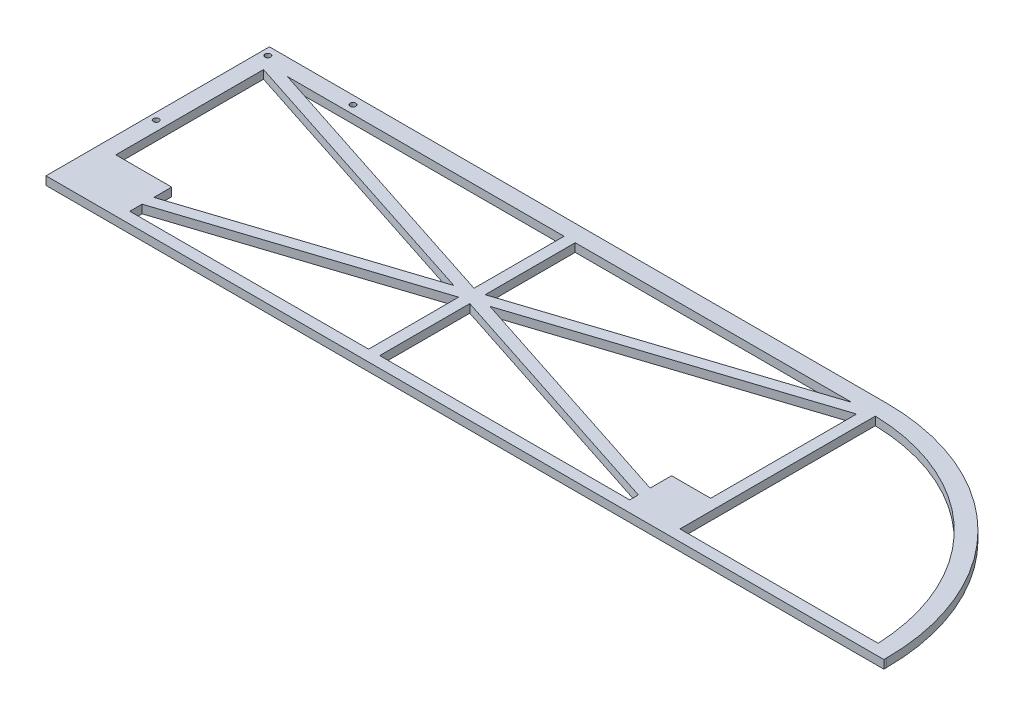
ISO-10303-21;
HEADER;
FILE_DESCRIPTION(('STEP AP214'),'2;1');
FILE_NAME('part.step','',(''),(''),'','','');
FILE_SCHEMA(('AUTOMOTIVE_DESIGN { 1 0 10303 214 1 1 1 1 }'));
ENDSEC;
DATA;
#1=APPLICATION_CONTEXT('core data for automotive mechanical design processes');
#2=APPLICATION_PROTOCOL_DEFINITION('international standard','automotive_design',2000,#1);
#3=PRODUCT_CONTEXT('',#1,'mechanical');
#4=PRODUCT('Part','Part','',(#3));
#5=PRODUCT_RELATED_PRODUCT_CATEGORY('part','',(#4));
#6=PRODUCT_DEFINITION_FORMATION('','',#4);
#7=PRODUCT_DEFINITION_CONTEXT('part definition',#1,'design');
#8=PRODUCT_DEFINITION('design','',#6,#7);
#9=PRODUCT_DEFINITION_SHAPE('','',#8);
#10=(LENGTH_UNIT() NAMED_UNIT(*) SI_UNIT(.MILLI.,.METRE.));
#11=(NAMED_UNIT(*) PLANE_ANGLE_UNIT() SI_UNIT($,.RADIAN.));
#12=(NAMED_UNIT(*) SI_UNIT($,.STERADIAN.) SOLID_ANGLE_UNIT());
#13=UNCERTAINTY_MEASURE_WITH_UNIT(LENGTH_MEASURE(1.E-05),#10,'distance_accuracy_value','');
#14=(GEOMETRIC_REPRESENTATION_CONTEXT(3) GLOBAL_UNCERTAINTY_ASSIGNED_CONTEXT((#13)) GLOBAL_UNIT_ASSIGNED_CONTEXT((#10,
#11,#12)) REPRESENTATION_CONTEXT('',''));
#15=CARTESIAN_POINT('',(0.,0.,0.));
#16=DIRECTION('',(0.,0.,1.));
#17=DIRECTION('',(1.,0.,0.));
#18=AXIS2_PLACEMENT_3D('',#15,#16,#17);
#19=CARTESIAN_POINT('',(0.,3.,0.));
#20=DIRECTION('',(0.,1.,0.));
#21=DIRECTION('',(0.,0.,1.));
#22=AXIS2_PLACEMENT_3D('',#19,#20,#21);
#23=PLANE('',#22);
#24=DIRECTION('',(0.,0.,1.));
#25=VECTOR('',#24,1.);
#26=CARTESIAN_POINT('',(-124.,3.,0.));
#27=LINE('',#26,#25);
#28=CARTESIAN_POINT('',(-124.,3.,31.5917058706223));
#29=VERTEX_POINT('',#28);
#30=CARTESIAN_POINT('',(-124.,3.,36.));
#31=VERTEX_POINT('',#30);
#32=EDGE_CURVE('E572',#29,#31,#27,.T.);
#33=ORIENTED_EDGE('',*,*,#32,.F.);
#34=DIRECTION('',(0.95087143148672,0.,-0.309586047460792));
#35=VECTOR('',#34,1.);
#36=CARTESIAN_POINT('',(-2.58473988551852,3.,-7.93884393409259));
#37=LINE('',#36,#35);
#38=CARTESIAN_POINT('',(-38.5,3.,3.75449656829671));
#39=VERTEX_POINT('',#38);
#40=EDGE_CURVE('E563',#29,#39,#37,.T.);
#41=ORIENTED_EDGE('',*,*,#40,.T.);
#42=DIRECTION('',(0.,0.,1.));
#43=VECTOR('',#42,1.);
#44=CARTESIAN_POINT('',(-38.5,3.,0.));
#45=LINE('',#44,#43);
#46=CARTESIAN_POINT('',(-38.5,3.,36.));
#47=VERTEX_POINT('',#46);
#48=EDGE_CURVE('E566',#39,#47,#45,.T.);
#49=ORIENTED_EDGE('',*,*,#48,.T.);
#50=DIRECTION('',(-1.,0.,0.));
#51=VECTOR('',#50,1.);
#52=CARTESIAN_POINT('',(0.,3.,36.));
#53=LINE('',#52,#51);
#54=EDGE_CURVE('E569',#47,#31,#53,.T.);
#55=ORIENTED_EDGE('',*,*,#54,.T.);
#56=EDGE_LOOP('',(#33,#41,#49,#55));
#57=FACE_BOUND('',#56,.T.);
#58=DIRECTION('',(0.,0.,1.));
#59=VECTOR('',#58,1.);
#60=CARTESIAN_POINT('',(-124.,3.,0.));
#61=LINE('',#60,#59);
#62=CARTESIAN_POINT('',(-124.,3.,21.));
#63=VERTEX_POINT('',#62);
#64=CARTESIAN_POINT('',(-124.,3.,27.3850383154242));
#65=VERTEX_POINT('',#64);
#66=EDGE_CURVE('E561',#63,#65,#61,.T.);
#67=ORIENTED_EDGE('',*,*,#66,.F.);
#68=DIRECTION('',(-1.,0.,0.));
#69=VECTOR('',#68,1.);
#70=CARTESIAN_POINT('',(0.,3.,21.));
#71=LINE('',#70,#69);
#72=CARTESIAN_POINT('',(-144.,3.,21.));
#73=VERTEX_POINT('',#72);
#74=EDGE_CURVE('E551',#63,#73,#71,.T.);
#75=ORIENTED_EDGE('',*,*,#74,.T.);
#76=DIRECTION('',(0.,0.,-1.));
#77=VECTOR('',#76,1.);
#78=CARTESIAN_POINT('',(-144.,3.,0.));
#79=LINE('',#78,#77);
#80=CARTESIAN_POINT('',(-144.,3.,-31.8966662224009));
#81=VERTEX_POINT('',#80);
#82=EDGE_CURVE('E554',#73,#81,#79,.T.);
#83=ORIENTED_EDGE('',*,*,#82,.T.);
#84=DIRECTION('',(-0.95087143148672,0.,-0.309586047460793));
#85=VECTOR('',#84,1.);
#86=CARTESIAN_POINT('',(-4.4118371315964,3.,13.5506426184746));
#87=LINE('',#86,#85);
#88=CARTESIAN_POINT('',(-42.9602394597686,3.,0.99999999999999));
#89=VERTEX_POINT('',#88);
#90=EDGE_CURVE('E557',#89,#81,#87,.T.);
#91=ORIENTED_EDGE('',*,*,#90,.F.);
#92=DIRECTION('',(0.95087143148672,0.,-0.309586047460793));
#93=VECTOR('',#92,1.);
#94=CARTESIAN_POINT('',(-3.82308407536169,3.,-11.7423296600395));
#95=LINE('',#94,#93);
#96=EDGE_CURVE('E559',#65,#89,#95,.T.);
#97=ORIENTED_EDGE('',*,*,#96,.F.);
#98=EDGE_LOOP('',(#67,#75,#83,#91,#97));
#99=FACE_BOUND('',#98,.T.);
#100=DIRECTION('',(0.95087143148672,0.,-0.309586047460793));
#101=VECTOR('',#100,1.);
#102=CARTESIAN_POINT('',(-3.82308407536169,3.,-11.7423296600395));
#103=LINE('',#102,#101);
#104=CARTESIAN_POINT('',(-34.5,3.,-1.75449656829677));
#105=VERTEX_POINT('',#104);
#106=CARTESIAN_POINT('',(64.5397605402314,3.,-34.));
#107=VERTEX_POINT('',#106);
#108=EDGE_CURVE('E524',#105,#107,#103,.T.);
#109=ORIENTED_EDGE('',*,*,#108,.F.);
#110=DIRECTION('',(0.,0.,1.));
#111=VECTOR('',#110,1.);
#112=CARTESIAN_POINT('',(-34.5,3.,0.));
#113=LINE('',#112,#111);
#114=CARTESIAN_POINT('',(-34.5,3.,-34.));
#115=VERTEX_POINT('',#114);
#116=EDGE_CURVE('E521',#115,#105,#113,.T.);
#117=ORIENTED_EDGE('',*,*,#116,.F.);
#118=DIRECTION('',(1.,0.,0.));
#119=VECTOR('',#118,1.);
#120=CARTESIAN_POINT('',(0.,3.,-34.));
#121=LINE('',#120,#119);
#122=EDGE_CURVE('E361',#115,#107,#121,.T.);
#123=ORIENTED_EDGE('',*,*,#122,.T.);
#124=EDGE_LOOP('',(#109,#117,#123));
#125=FACE_BOUND('',#124,.T.);
#126=CARTESIAN_POINT('',(-147.557778193301,3.,3.00000000000007));
#127=DIRECTION('',(0.,1.,0.));
#128=DIRECTION('',(0.,0.,1.));
#129=AXIS2_PLACEMENT_3D('',#126,#127,#128);
#130=CIRCLE('',#129,0.999999999999998);
#131=CARTESIAN_POINT('',(-147.557778193301,3.,4.00000000000007));
#132=VERTEX_POINT('',#131);
#133=EDGE_CURVE('E575',#132,#132,#130,.T.);
#134=ORIENTED_EDGE('',*,*,#133,.F.);
#135=EDGE_LOOP('',(#134));
#136=FACE_BOUND('',#135,.T.);
#137=CARTESIAN_POINT('',(-147.557778193302,3.,-36.9999999999999));
#138=DIRECTION('',(0.,1.,0.));
#139=DIRECTION('',(0.,0.,1.));
#140=AXIS2_PLACEMENT_3D('',#137,#138,#139);
#141=CIRCLE('',#140,0.999999999999998);
#142=CARTESIAN_POINT('',(-147.557778193302,3.,-35.9999999999999));
#143=VERTEX_POINT('',#142);
#144=EDGE_CURVE('E578',#143,#143,#141,.T.);
#145=ORIENTED_EDGE('',*,*,#144,.F.);
#146=EDGE_LOOP('',(#145));
#147=FACE_BOUND('',#146,.T.);
#148=CARTESIAN_POINT('',(-117.057778193302,3.,-37.));
#149=DIRECTION('',(0.,1.,0.));
#150=DIRECTION('',(0.,0.,1.));
#151=AXIS2_PLACEMENT_3D('',#148,#149,#150);
#152=CIRCLE('',#151,0.999999999999926);
#153=CARTESIAN_POINT('',(-117.057778193302,3.,-36.));
#154=VERTEX_POINT('',#153);
#155=EDGE_CURVE('E582',#154,#154,#152,.T.);
#156=ORIENTED_EDGE('',*,*,#155,.F.);
#157=EDGE_LOOP('',(#156));
#158=FACE_BOUND('',#157,.T.);
#159=CARTESIAN_POINT('',(71.,3.,39.));
#160=DIRECTION('',(0.,1.,0.));
#161=DIRECTION('',(0.,0.,1.));
#162=AXIS2_PLACEMENT_3D('',#159,#160,#161);
#163=CIRCLE('',#162,79.);
#164=CARTESIAN_POINT('',(71.,3.,-40.));
#165=VERTEX_POINT('',#164);
#166=CARTESIAN_POINT('',(150.,3.,39.));
#167=VERTEX_POINT('',#166);
#168=EDGE_CURVE('E585',#165,#167,#163,.F.);
#169=ORIENTED_EDGE('',*,*,#168,.F.);
#170=DIRECTION('',(1.,0.,0.));
#171=VECTOR('',#170,1.);
#172=CARTESIAN_POINT('',(0.,3.,-40.));
#173=LINE('',#172,#171);
#174=CARTESIAN_POINT('',(-150.,3.,-40.));
#175=VERTEX_POINT('',#174);
#176=EDGE_CURVE('E588',#175,#165,#173,.T.);
#177=ORIENTED_EDGE('',*,*,#176,.F.);
#178=DIRECTION('',(0.,0.,1.));
#179=VECTOR('',#178,1.);
#180=CARTESIAN_POINT('',(-150.,3.,0.));
#181=LINE('',#180,#179);
#182=CARTESIAN_POINT('',(-150.,3.,40.));
#183=VERTEX_POINT('',#182);
#184=EDGE_CURVE('E591',#175,#183,#181,.T.);
#185=ORIENTED_EDGE('',*,*,#184,.T.);
#186=DIRECTION('',(1.,0.,0.));
#187=VECTOR('',#186,1.);
#188=CARTESIAN_POINT('',(0.,3.,40.));
#189=LINE('',#188,#187);
#190=CARTESIAN_POINT('',(150.,3.,40.));
#191=VERTEX_POINT('',#190);
#192=EDGE_CURVE('E594',#183,#191,#189,.T.);
#193=ORIENTED_EDGE('',*,*,#192,.T.);
#194=DIRECTION('',(0.,0.,1.));
#195=VECTOR('',#194,1.);
#196=CARTESIAN_POINT('',(150.000000000001,3.,4.16333634234433E-12));
#197=LINE('',#196,#195);
#198=EDGE_CURVE('E596',#167,#191,#197,.T.);
#199=ORIENTED_EDGE('',*,*,#198,.F.);
#200=EDGE_LOOP('',(#169,#177,#185,#193,#199));
#201=FACE_BOUND('',#200,.T.);
#202=DIRECTION('',(-0.95087143148672,0.,-0.309586047460792));
#203=VECTOR('',#202,1.);
#204=CARTESIAN_POINT('',(-3.17349294175323,3.,9.74715689252779));
#205=LINE('',#204,#203);
#206=CARTESIAN_POINT('',(-38.5,3.,-1.75449656829671));
#207=VERTEX_POINT('',#206);
#208=CARTESIAN_POINT('',(-137.539760540232,3.,-34.));
#209=VERTEX_POINT('',#208);
#210=EDGE_CURVE('E506',#207,#209,#205,.T.);
#211=ORIENTED_EDGE('',*,*,#210,.T.);
#212=DIRECTION('',(1.,0.,0.));
#213=VECTOR('',#212,1.);
#214=CARTESIAN_POINT('',(0.,3.,-34.));
#215=LINE('',#214,#213);
#216=CARTESIAN_POINT('',(-38.5,3.,-34.));
#217=VERTEX_POINT('',#216);
#218=EDGE_CURVE('E509',#209,#217,#215,.T.);
#219=ORIENTED_EDGE('',*,*,#218,.T.);
#220=DIRECTION('',(0.,0.,1.));
#221=VECTOR('',#220,1.);
#222=CARTESIAN_POINT('',(-38.5,3.,0.));
#223=LINE('',#222,#221);
#224=EDGE_CURVE('E503',#217,#207,#223,.T.);
#225=ORIENTED_EDGE('',*,*,#224,.T.);
#226=EDGE_LOOP('',(#211,#219,#225));
#227=FACE_BOUND('',#226,.T.);
#228=CARTESIAN_POINT('',(71.,3.,39.));
#229=DIRECTION('',(0.,1.,0.));
#230=DIRECTION('',(0.,0.,1.));
#231=AXIS2_PLACEMENT_3D('',#228,#229,#230);
#232=CIRCLE('',#231,73.);
#233=CARTESIAN_POINT('',(73.,3.,-33.9725975966321));
#234=VERTEX_POINT('',#233);
#235=CARTESIAN_POINT('',(143.938330115242,3.,36.));
#236=VERTEX_POINT('',#235);
#237=EDGE_CURVE('E515',#234,#236,#232,.F.);
#238=ORIENTED_EDGE('',*,*,#237,.T.);
#239=DIRECTION('',(-1.,0.,0.));
#240=VECTOR('',#239,1.);
#241=CARTESIAN_POINT('',(0.,3.,36.));
#242=LINE('',#241,#240);
#243=CARTESIAN_POINT('',(73.,3.,36.));
#244=VERTEX_POINT('',#243);
#245=EDGE_CURVE('E518',#236,#244,#242,.T.);
#246=ORIENTED_EDGE('',*,*,#245,.T.);
#247=DIRECTION('',(0.,0.,-1.));
#248=VECTOR('',#247,1.);
#249=CARTESIAN_POINT('',(73.,3.,0.));
#250=LINE('',#249,#248);
#251=EDGE_CURVE('E512',#244,#234,#250,.T.);
#252=ORIENTED_EDGE('',*,*,#251,.T.);
#253=EDGE_LOOP('',(#238,#246,#252));
#254=FACE_BOUND('',#253,.T.);
#255=DIRECTION('',(0.,0.,1.));
#256=VECTOR('',#255,1.);
#257=CARTESIAN_POINT('',(55.,3.,0.));
#258=LINE('',#257,#256);
#259=CARTESIAN_POINT('',(55.,3.,32.8940314520177));
#260=VERTEX_POINT('',#259);
#261=CARTESIAN_POINT('',(55.,3.,36.));
#262=VERTEX_POINT('',#261);
#263=EDGE_CURVE('E531',#260,#262,#258,.T.);
#264=ORIENTED_EDGE('',*,*,#263,.T.);
#265=DIRECTION('',(-1.,0.,0.));
#266=VECTOR('',#265,1.);
#267=CARTESIAN_POINT('',(0.,3.,36.));
#268=LINE('',#267,#266);
#269=CARTESIAN_POINT('',(-34.5,3.,36.));
#270=VERTEX_POINT('',#269);
#271=EDGE_CURVE('E534',#262,#270,#268,.T.);
#272=ORIENTED_EDGE('',*,*,#271,.T.);
#273=DIRECTION('',(0.,0.,1.));
#274=VECTOR('',#273,1.);
#275=CARTESIAN_POINT('',(-34.5,3.,0.));
#276=LINE('',#275,#274);
#277=CARTESIAN_POINT('',(-34.5,3.,3.75449656829675));
#278=VERTEX_POINT('',#277);
#279=EDGE_CURVE('E526',#278,#270,#276,.T.);
#280=ORIENTED_EDGE('',*,*,#279,.F.);
#281=DIRECTION('',(-0.95087143148672,0.,-0.309586047460793));
#282=VECTOR('',#281,1.);
#283=CARTESIAN_POINT('',(-4.4118371315964,3.,13.5506426184746));
#284=LINE('',#283,#282);
#285=EDGE_CURVE('E528',#260,#278,#284,.T.);
#286=ORIENTED_EDGE('',*,*,#285,.F.);
#287=EDGE_LOOP('',(#264,#272,#280,#286));
#288=FACE_BOUND('',#287,.T.);
#289=DIRECTION('',(0.,0.,1.));
#290=VECTOR('',#289,1.);
#291=CARTESIAN_POINT('',(55.,3.,0.));
#292=LINE('',#291,#290);
#293=CARTESIAN_POINT('',(55.,3.,21.));
#294=VERTEX_POINT('',#293);
#295=CARTESIAN_POINT('',(55.,3.,28.6873638968195));
#296=VERTEX_POINT('',#295);
#297=EDGE_CURVE('E545',#294,#296,#292,.T.);
#298=ORIENTED_EDGE('',*,*,#297,.T.);
#299=DIRECTION('',(-0.95087143148672,0.,-0.309586047460792));
#300=VECTOR('',#299,1.);
#301=CARTESIAN_POINT('',(-3.17349294175323,3.,9.74715689252779));
#302=LINE('',#301,#300);
#303=CARTESIAN_POINT('',(-30.0397605402315,3.,1.));
#304=VERTEX_POINT('',#303);
#305=EDGE_CURVE('E548',#296,#304,#302,.T.);
#306=ORIENTED_EDGE('',*,*,#305,.T.);
#307=DIRECTION('',(0.95087143148672,0.,-0.309586047460792));
#308=VECTOR('',#307,1.);
#309=CARTESIAN_POINT('',(-2.58473988551852,3.,-7.93884393409259));
#310=LINE('',#309,#308);
#311=CARTESIAN_POINT('',(69.,3.,-31.2455034317033));
#312=VERTEX_POINT('',#311);
#313=EDGE_CURVE('E537',#304,#312,#310,.T.);
#314=ORIENTED_EDGE('',*,*,#313,.T.);
#315=DIRECTION('',(0.,0.,-1.));
#316=VECTOR('',#315,1.);
#317=CARTESIAN_POINT('',(69.,3.,0.));
#318=LINE('',#317,#316);
#319=CARTESIAN_POINT('',(69.,3.,21.));
#320=VERTEX_POINT('',#319);
#321=EDGE_CURVE('E540',#320,#312,#318,.T.);
#322=ORIENTED_EDGE('',*,*,#321,.F.);
#323=DIRECTION('',(1.,0.,0.));
#324=VECTOR('',#323,1.);
#325=CARTESIAN_POINT('',(0.,3.,21.));
#326=LINE('',#325,#324);
#327=EDGE_CURVE('E543',#294,#320,#326,.T.);
#328=ORIENTED_EDGE('',*,*,#327,.F.);
#329=EDGE_LOOP('',(#298,#306,#314,#322,#328));
#330=FACE_BOUND('',#329,.T.);
#331=ADVANCED_FACE('F145',(#57,#99,#125,#136,#147,#158,#201,#227,#254,#288,#330),#23,.T.);
#332=CARTESIAN_POINT('',(0.,0.,0.));
#333=DIRECTION('',(0.,1.,0.));
#334=DIRECTION('',(0.,0.,1.));
#335=AXIS2_PLACEMENT_3D('',#332,#333,#334);
#336=PLANE('',#335);
#337=DIRECTION('',(-0.95087143148672,0.,0.309586047460792));
#338=VECTOR('',#337,1.);
#339=CARTESIAN_POINT('',(-2.58473988551852,0.,-7.93884393409259));
#340=LINE('',#339,#338);
#341=CARTESIAN_POINT('',(-38.5,0.,3.75449656829671));
#342=VERTEX_POINT('',#341);
#343=CARTESIAN_POINT('',(-124.,0.,31.5917058706223));
#344=VERTEX_POINT('',#343);
#345=EDGE_CURVE('E407',#342,#344,#340,.T.);
#346=ORIENTED_EDGE('',*,*,#345,.T.);
#347=DIRECTION('',(0.,0.,-1.));
#348=VECTOR('',#347,1.);
#349=CARTESIAN_POINT('',(-124.,0.,0.));
#350=LINE('',#349,#348);
#351=CARTESIAN_POINT('',(-124.,0.,36.));
#352=VERTEX_POINT('',#351);
#353=EDGE_CURVE('E416',#352,#344,#350,.T.);
#354=ORIENTED_EDGE('',*,*,#353,.F.);
#355=DIRECTION('',(1.,0.,0.));
#356=VECTOR('',#355,1.);
#357=CARTESIAN_POINT('',(0.,0.,36.));
#358=LINE('',#357,#356);
#359=CARTESIAN_POINT('',(-38.5,0.,36.));
#360=VERTEX_POINT('',#359);
#361=EDGE_CURVE('E413',#352,#360,#358,.T.);
#362=ORIENTED_EDGE('',*,*,#361,.T.);
#363=DIRECTION('',(0.,0.,-1.));
#364=VECTOR('',#363,1.);
#365=CARTESIAN_POINT('',(-38.5,0.,0.));
#366=LINE('',#365,#364);
#367=EDGE_CURVE('E410',#360,#342,#366,.T.);
#368=ORIENTED_EDGE('',*,*,#367,.T.);
#369=EDGE_LOOP('',(#346,#354,#362,#368));
#370=FACE_BOUND('',#369,.T.);
#371=DIRECTION('',(1.,0.,0.));
#372=VECTOR('',#371,1.);
#373=CARTESIAN_POINT('',(0.,0.,21.));
#374=LINE('',#373,#372);
#375=CARTESIAN_POINT('',(-144.,0.,21.));
#376=VERTEX_POINT('',#375);
#377=CARTESIAN_POINT('',(-124.,0.,21.));
#378=VERTEX_POINT('',#377);
#379=EDGE_CURVE('E428',#376,#378,#374,.T.);
#380=ORIENTED_EDGE('',*,*,#379,.T.);
#381=DIRECTION('',(0.,0.,-1.));
#382=VECTOR('',#381,1.);
#383=CARTESIAN_POINT('',(-124.,0.,0.));
#384=LINE('',#383,#382);
#385=CARTESIAN_POINT('',(-124.,0.,27.3850383154242));
#386=VERTEX_POINT('',#385);
#387=EDGE_CURVE('E440',#386,#378,#384,.T.);
#388=ORIENTED_EDGE('',*,*,#387,.F.);
#389=DIRECTION('',(-0.95087143148672,0.,0.309586047460793));
#390=VECTOR('',#389,1.);
#391=CARTESIAN_POINT('',(-3.82308407536169,0.,-11.7423296600395));
#392=LINE('',#391,#390);
#393=CARTESIAN_POINT('',(-42.9602394597686,0.,0.99999999999999));
#394=VERTEX_POINT('',#393);
#395=EDGE_CURVE('E437',#394,#386,#392,.T.);
#396=ORIENTED_EDGE('',*,*,#395,.F.);
#397=DIRECTION('',(0.95087143148672,0.,0.309586047460793));
#398=VECTOR('',#397,1.);
#399=CARTESIAN_POINT('',(-4.4118371315964,0.,13.5506426184746));
#400=LINE('',#399,#398);
#401=CARTESIAN_POINT('',(-144.,0.,-31.8966662224009));
#402=VERTEX_POINT('',#401);
#403=EDGE_CURVE('E434',#402,#394,#400,.T.);
#404=ORIENTED_EDGE('',*,*,#403,.F.);
#405=DIRECTION('',(0.,0.,1.));
#406=VECTOR('',#405,1.);
#407=CARTESIAN_POINT('',(-144.,0.,0.));
#408=LINE('',#407,#406);
#409=EDGE_CURVE('E431',#402,#376,#408,.T.);
#410=ORIENTED_EDGE('',*,*,#409,.T.);
#411=EDGE_LOOP('',(#380,#388,#396,#404,#410));
#412=FACE_BOUND('',#411,.T.);
#413=DIRECTION('',(1.,0.,0.));
#414=VECTOR('',#413,1.);
#415=CARTESIAN_POINT('',(0.,0.,36.));
#416=LINE('',#415,#414);
#417=CARTESIAN_POINT('',(-34.5,0.,36.));
#418=VERTEX_POINT('',#417);
#419=CARTESIAN_POINT('',(55.,0.,36.));
#420=VERTEX_POINT('',#419);
#421=EDGE_CURVE('E401',#418,#420,#416,.T.);
#422=ORIENTED_EDGE('',*,*,#421,.T.);
#423=DIRECTION('',(0.,0.,-1.));
#424=VECTOR('',#423,1.);
#425=CARTESIAN_POINT('',(55.,0.,0.));
#426=LINE('',#425,#424);
#427=CARTESIAN_POINT('',(55.,0.,32.8940314520177));
#428=VERTEX_POINT('',#427);
#429=EDGE_CURVE('E483',#420,#428,#426,.T.);
#430=ORIENTED_EDGE('',*,*,#429,.T.);
#431=DIRECTION('',(0.95087143148672,0.,0.309586047460793));
#432=VECTOR('',#431,1.);
#433=CARTESIAN_POINT('',(-4.4118371315964,0.,13.5506426184746));
#434=LINE('',#433,#432);
#435=CARTESIAN_POINT('',(-34.5,0.,3.75449656829675));
#436=VERTEX_POINT('',#435);
#437=EDGE_CURVE('E480',#436,#428,#434,.T.);
#438=ORIENTED_EDGE('',*,*,#437,.F.);
#439=DIRECTION('',(0.,0.,-1.));
#440=VECTOR('',#439,1.);
#441=CARTESIAN_POINT('',(-34.5,0.,0.));
#442=LINE('',#441,#440);
#443=EDGE_CURVE('E477',#418,#436,#442,.T.);
#444=ORIENTED_EDGE('',*,*,#443,.F.);
#445=EDGE_LOOP('',(#422,#430,#438,#444));
#446=FACE_BOUND('',#445,.T.);
#447=DIRECTION('',(0.,0.,-1.));
#448=VECTOR('',#447,1.);
#449=CARTESIAN_POINT('',(-34.5,0.,0.));
#450=LINE('',#449,#448);
#451=CARTESIAN_POINT('',(-34.5,0.,-1.75449656829677));
#452=VERTEX_POINT('',#451);
#453=CARTESIAN_POINT('',(-34.5,0.,-34.));
#454=VERTEX_POINT('',#453);
#455=EDGE_CURVE('E369',#452,#454,#450,.T.);
#456=ORIENTED_EDGE('',*,*,#455,.F.);
#457=DIRECTION('',(-0.95087143148672,0.,0.309586047460793));
#458=VECTOR('',#457,1.);
#459=CARTESIAN_POINT('',(-3.82308407536169,0.,-11.7423296600395));
#460=LINE('',#459,#458);
#461=CARTESIAN_POINT('',(64.5397605402314,0.,-34.));
#462=VERTEX_POINT('',#461);
#463=EDGE_CURVE('E376',#462,#452,#460,.T.);
#464=ORIENTED_EDGE('',*,*,#463,.F.);
#465=DIRECTION('',(-1.,0.,0.));
#466=VECTOR('',#465,1.);
#467=CARTESIAN_POINT('',(0.,0.,-34.));
#468=LINE('',#467,#466);
#469=EDGE_CURVE('E358',#462,#454,#468,.T.);
#470=ORIENTED_EDGE('',*,*,#469,.T.);
#471=EDGE_LOOP('',(#456,#464,#470));
#472=FACE_BOUND('',#471,.T.);
#473=DIRECTION('',(-1.,0.,0.));
#474=VECTOR('',#473,1.);
#475=CARTESIAN_POINT('',(0.,0.,-34.));
#476=LINE('',#475,#474);
#477=CARTESIAN_POINT('',(-38.5,0.,-34.));
#478=VERTEX_POINT('',#477);
#479=CARTESIAN_POINT('',(-137.539760540232,0.,-34.));
#480=VERTEX_POINT('',#479);
#481=EDGE_CURVE('E442',#478,#480,#476,.T.);
#482=ORIENTED_EDGE('',*,*,#481,.T.);
#483=DIRECTION('',(0.95087143148672,0.,0.309586047460792));
#484=VECTOR('',#483,1.);
#485=CARTESIAN_POINT('',(-3.17349294175323,0.,9.74715689252779));
#486=LINE('',#485,#484);
#487=CARTESIAN_POINT('',(-38.5,0.,-1.75449656829671));
#488=VERTEX_POINT('',#487);
#489=EDGE_CURVE('E490',#480,#488,#486,.T.);
#490=ORIENTED_EDGE('',*,*,#489,.T.);
#491=DIRECTION('',(0.,0.,-1.));
#492=VECTOR('',#491,1.);
#493=CARTESIAN_POINT('',(-38.5,0.,0.));
#494=LINE('',#493,#492);
#495=EDGE_CURVE('E493',#488,#478,#494,.T.);
#496=ORIENTED_EDGE('',*,*,#495,.T.);
#497=EDGE_LOOP('',(#482,#490,#496));
#498=FACE_BOUND('',#497,.T.);
#499=CARTESIAN_POINT('',(-147.557778193301,0.,3.00000000000007));
#500=DIRECTION('',(0.,1.,0.));
#501=DIRECTION('',(0.,0.,1.));
#502=AXIS2_PLACEMENT_3D('',#499,#500,#501);
#503=CIRCLE('',#502,0.999999999999998);
#504=CARTESIAN_POINT('',(-147.557778193301,0.,4.00000000000007));
#505=VERTEX_POINT('',#504);
#506=EDGE_CURVE('E574',#505,#505,#503,.T.);
#507=ORIENTED_EDGE('',*,*,#506,.T.);
#508=EDGE_LOOP('',(#507));
#509=FACE_BOUND('',#508,.T.);
#510=CARTESIAN_POINT('',(-147.557778193302,0.,-36.9999999999999));
#511=DIRECTION('',(0.,1.,0.));
#512=DIRECTION('',(0.,0.,1.));
#513=AXIS2_PLACEMENT_3D('',#510,#511,#512);
#514=CIRCLE('',#513,0.999999999999998);
#515=CARTESIAN_POINT('',(-147.557778193302,0.,-35.9999999999999));
#516=VERTEX_POINT('',#515);
#517=EDGE_CURVE('E602',#516,#516,#514,.T.);
#518=ORIENTED_EDGE('',*,*,#517,.T.);
#519=EDGE_LOOP('',(#518));
#520=FACE_BOUND('',#519,.T.);
#521=CARTESIAN_POINT('',(-117.057778193302,0.,-37.));
#522=DIRECTION('',(0.,1.,0.));
#523=DIRECTION('',(0.,0.,1.));
#524=AXIS2_PLACEMENT_3D('',#521,#522,#523);
#525=CIRCLE('',#524,0.999999999999926);
#526=CARTESIAN_POINT('',(-117.057778193302,0.,-36.));
#527=VERTEX_POINT('',#526);
#528=EDGE_CURVE('E605',#527,#527,#525,.T.);
#529=ORIENTED_EDGE('',*,*,#528,.T.);
#530=EDGE_LOOP('',(#529));
#531=FACE_BOUND('',#530,.T.);
#532=CARTESIAN_POINT('',(71.,0.,39.));
#533=DIRECTION('',(0.,1.,0.));
#534=DIRECTION('',(0.,0.,1.));
#535=AXIS2_PLACEMENT_3D('',#532,#533,#534);
#536=CIRCLE('',#535,79.);
#537=CARTESIAN_POINT('',(71.,0.,-40.));
#538=VERTEX_POINT('',#537);
#539=CARTESIAN_POINT('',(150.,0.,39.));
#540=VERTEX_POINT('',#539);
#541=EDGE_CURVE('E608',#538,#540,#536,.F.);
#542=ORIENTED_EDGE('',*,*,#541,.T.);
#543=DIRECTION('',(0.,0.,1.));
#544=VECTOR('',#543,1.);
#545=CARTESIAN_POINT('',(150.000000000001,0.,4.16333634234433E-12));
#546=LINE('',#545,#544);
#547=CARTESIAN_POINT('',(150.,0.,40.));
#548=VERTEX_POINT('',#547);
#549=EDGE_CURVE('E579',#540,#548,#546,.T.);
#550=ORIENTED_EDGE('',*,*,#549,.T.);
#551=DIRECTION('',(1.,0.,0.));
#552=VECTOR('',#551,1.);
#553=CARTESIAN_POINT('',(0.,0.,40.));
#554=LINE('',#553,#552);
#555=CARTESIAN_POINT('',(-150.,0.,40.));
#556=VERTEX_POINT('',#555);
#557=EDGE_CURVE('E617',#556,#548,#554,.T.);
#558=ORIENTED_EDGE('',*,*,#557,.F.);
#559=DIRECTION('',(0.,0.,1.));
#560=VECTOR('',#559,1.);
#561=CARTESIAN_POINT('',(-150.,0.,0.));
#562=LINE('',#561,#560);
#563=CARTESIAN_POINT('',(-150.,0.,-40.));
#564=VERTEX_POINT('',#563);
#565=EDGE_CURVE('E614',#564,#556,#562,.T.);
#566=ORIENTED_EDGE('',*,*,#565,.F.);
#567=DIRECTION('',(1.,0.,0.));
#568=VECTOR('',#567,1.);
#569=CARTESIAN_POINT('',(0.,0.,-40.));
#570=LINE('',#569,#568);
#571=EDGE_CURVE('E611',#564,#538,#570,.T.);
#572=ORIENTED_EDGE('',*,*,#571,.T.);
#573=EDGE_LOOP('',(#542,#550,#558,#566,#572));
#574=FACE_BOUND('',#573,.T.);
#575=DIRECTION('',(1.,0.,0.));
#576=VECTOR('',#575,1.);
#577=CARTESIAN_POINT('',(0.,0.,36.));
#578=LINE('',#577,#576);
#579=CARTESIAN_POINT('',(73.,0.,36.));
#580=VERTEX_POINT('',#579);
#581=CARTESIAN_POINT('',(143.938330115242,0.,36.));
#582=VERTEX_POINT('',#581);
#583=EDGE_CURVE('E395',#580,#582,#578,.T.);
#584=ORIENTED_EDGE('',*,*,#583,.T.);
#585=CARTESIAN_POINT('',(71.,0.,39.));
#586=DIRECTION('',(0.,1.,0.));
#587=DIRECTION('',(0.,0.,1.));
#588=AXIS2_PLACEMENT_3D('',#585,#586,#587);
#589=CIRCLE('',#588,73.);
#590=CARTESIAN_POINT('',(73.,0.,-33.9725975966321));
#591=VERTEX_POINT('',#590);
#592=EDGE_CURVE('E392',#582,#591,#589,.T.);
#593=ORIENTED_EDGE('',*,*,#592,.T.);
#594=DIRECTION('',(0.,0.,1.));
#595=VECTOR('',#594,1.);
#596=CARTESIAN_POINT('',(73.,0.,0.));
#597=LINE('',#596,#595);
#598=EDGE_CURVE('E389',#591,#580,#597,.T.);
#599=ORIENTED_EDGE('',*,*,#598,.T.);
#600=EDGE_LOOP('',(#584,#593,#599));
#601=FACE_BOUND('',#600,.T.);
#602=DIRECTION('',(0.95087143148672,0.,0.309586047460792));
#603=VECTOR('',#602,1.);
#604=CARTESIAN_POINT('',(-3.17349294175323,0.,9.74715689252779));
#605=LINE('',#604,#603);
#606=CARTESIAN_POINT('',(-30.0397605402315,0.,0.999999999999999));
#607=VERTEX_POINT('',#606);
#608=CARTESIAN_POINT('',(55.,0.,28.6873638968195));
#609=VERTEX_POINT('',#608);
#610=EDGE_CURVE('E465',#607,#609,#605,.T.);
#611=ORIENTED_EDGE('',*,*,#610,.T.);
#612=DIRECTION('',(0.,0.,-1.));
#613=VECTOR('',#612,1.);
#614=CARTESIAN_POINT('',(55.,0.,0.));
#615=LINE('',#614,#613);
#616=CARTESIAN_POINT('',(55.,0.,21.));
#617=VERTEX_POINT('',#616);
#618=EDGE_CURVE('E462',#609,#617,#615,.T.);
#619=ORIENTED_EDGE('',*,*,#618,.T.);
#620=DIRECTION('',(-1.,0.,0.));
#621=VECTOR('',#620,1.);
#622=CARTESIAN_POINT('',(0.,0.,21.));
#623=LINE('',#622,#621);
#624=CARTESIAN_POINT('',(69.,0.,21.));
#625=VERTEX_POINT('',#624);
#626=EDGE_CURVE('E459',#625,#617,#623,.T.);
#627=ORIENTED_EDGE('',*,*,#626,.F.);
#628=DIRECTION('',(0.,0.,1.));
#629=VECTOR('',#628,1.);
#630=CARTESIAN_POINT('',(69.,0.,0.));
#631=LINE('',#630,#629);
#632=CARTESIAN_POINT('',(69.,0.,-31.2455034317033));
#633=VERTEX_POINT('',#632);
#634=EDGE_CURVE('E456',#633,#625,#631,.T.);
#635=ORIENTED_EDGE('',*,*,#634,.F.);
#636=DIRECTION('',(-0.95087143148672,0.,0.309586047460792));
#637=VECTOR('',#636,1.);
#638=CARTESIAN_POINT('',(-2.58473988551852,0.,-7.93884393409259));
#639=LINE('',#638,#637);
#640=EDGE_CURVE('E453',#633,#607,#639,.T.);
#641=ORIENTED_EDGE('',*,*,#640,.T.);
#642=EDGE_LOOP('',(#611,#619,#627,#635,#641));
#643=FACE_BOUND('',#642,.T.);
#644=ADVANCED_FACE('F374',(#370,#412,#446,#472,#498,#509,#520,#531,#574,#601,#643),#336,.F.);
#645=CARTESIAN_POINT('',(71.,3.,39.));
#646=DIRECTION('',(0.,-1.,0.));
#647=DIRECTION('',(0.,0.,-1.));
#648=AXIS2_PLACEMENT_3D('',#645,#646,#647);
#649=CYLINDRICAL_SURFACE('',#648,79.);
#650=ORIENTED_EDGE('',*,*,#541,.F.);
#651=DIRECTION('',(0.,-1.,0.));
#652=VECTOR('',#651,1.);
#653=CARTESIAN_POINT('',(71.,3.,-40.));
#654=LINE('',#653,#652);
#655=EDGE_CURVE('E12',#165,#538,#654,.T.);
#656=ORIENTED_EDGE('',*,*,#655,.F.);
#657=ORIENTED_EDGE('',*,*,#168,.T.);
#658=DIRECTION('',(0.,-1.,0.));
#659=VECTOR('',#658,1.);
#660=CARTESIAN_POINT('',(150.,3.,39.));
#661=LINE('',#660,#659);
#662=EDGE_CURVE('E599',#167,#540,#661,.T.);
#663=ORIENTED_EDGE('',*,*,#662,.T.);
#664=EDGE_LOOP('',(#650,#656,#657,#663));
#665=FACE_BOUND('',#664,.T.);
#666=ADVANCED_FACE('F641',(#665),#649,.T.);
#667=CARTESIAN_POINT('',(0.,3.,-40.));
#668=DIRECTION('',(0.,0.,-1.));
#669=DIRECTION('',(-1.,0.,0.));
#670=AXIS2_PLACEMENT_3D('',#667,#668,#669);
#671=PLANE('',#670);
#672=ORIENTED_EDGE('',*,*,#571,.F.);
#673=DIRECTION('',(0.,-1.,0.));
#674=VECTOR('',#673,1.);
#675=CARTESIAN_POINT('',(-150.,3.,-40.));
#676=LINE('',#675,#674);
#677=EDGE_CURVE('E153',#175,#564,#676,.T.);
#678=ORIENTED_EDGE('',*,*,#677,.F.);
#679=ORIENTED_EDGE('',*,*,#176,.T.);
#680=ORIENTED_EDGE('',*,*,#655,.T.);
#681=EDGE_LOOP('',(#672,#678,#679,#680));
#682=FACE_BOUND('',#681,.T.);
#683=ADVANCED_FACE('F637',(#682),#671,.T.);
#684=CARTESIAN_POINT('',(-150.,3.,0.));
#685=DIRECTION('',(1.,0.,0.));
#686=DIRECTION('',(0.,0.,-1.));
#687=AXIS2_PLACEMENT_3D('',#684,#685,#686);
#688=PLANE('',#687);
#689=ORIENTED_EDGE('',*,*,#565,.T.);
#690=DIRECTION('',(0.,-1.,0.));
#691=VECTOR('',#690,1.);
#692=CARTESIAN_POINT('',(-150.,3.,40.));
#693=LINE('',#692,#691);
#694=EDGE_CURVE('E625',#183,#556,#693,.T.);
#695=ORIENTED_EDGE('',*,*,#694,.F.);
#696=ORIENTED_EDGE('',*,*,#184,.F.);
#697=ORIENTED_EDGE('',*,*,#677,.T.);
#698=EDGE_LOOP('',(#689,#695,#696,#697));
#699=FACE_BOUND('',#698,.T.);
#700=ADVANCED_FACE('F630',(#699),#688,.F.);
#701=CARTESIAN_POINT('',(0.,3.,40.));
#702=DIRECTION('',(0.,0.,-1.));
#703=DIRECTION('',(-1.,0.,0.));
#704=AXIS2_PLACEMENT_3D('',#701,#702,#703);
#705=PLANE('',#704);
#706=ORIENTED_EDGE('',*,*,#557,.T.);
#707=DIRECTION('',(0.,-1.,0.));
#708=VECTOR('',#707,1.);
#709=CARTESIAN_POINT('',(150.,3.,40.));
#710=LINE('',#709,#708);
#711=EDGE_CURVE('E623',#191,#548,#710,.T.);
#712=ORIENTED_EDGE('',*,*,#711,.F.);
#713=ORIENTED_EDGE('',*,*,#192,.F.);
#714=ORIENTED_EDGE('',*,*,#694,.T.);
#715=EDGE_LOOP('',(#706,#712,#713,#714));
#716=FACE_BOUND('',#715,.T.);
#717=ADVANCED_FACE('F648',(#716),#705,.F.);
#718=CARTESIAN_POINT('',(-117.057778193302,3.,-37.));
#719=DIRECTION('',(0.,-1.,0.));
#720=DIRECTION('',(0.,0.,-1.));
#721=AXIS2_PLACEMENT_3D('',#718,#719,#720);
#722=CYLINDRICAL_SURFACE('',#721,0.999999999999926);
#723=ORIENTED_EDGE('',*,*,#155,.T.);
#724=EDGE_LOOP('',(#723));
#725=FACE_BOUND('',#724,.T.);
#726=ORIENTED_EDGE('',*,*,#528,.F.);
#727=EDGE_LOOP('',(#726));
#728=FACE_BOUND('',#727,.T.);
#729=ADVANCED_FACE('F728',(#725,#728),#722,.F.);
#730=CARTESIAN_POINT('',(-147.557778193302,3.,-36.9999999999999));
#731=DIRECTION('',(0.,-1.,0.));
#732=DIRECTION('',(0.,0.,-1.));
#733=AXIS2_PLACEMENT_3D('',#730,#731,#732);
#734=CYLINDRICAL_SURFACE('',#733,0.999999999999998);
#735=ORIENTED_EDGE('',*,*,#144,.T.);
#736=EDGE_LOOP('',(#735));
#737=FACE_BOUND('',#736,.T.);
#738=ORIENTED_EDGE('',*,*,#517,.F.);
#739=EDGE_LOOP('',(#738));
#740=FACE_BOUND('',#739,.T.);
#741=ADVANCED_FACE('F736',(#737,#740),#734,.F.);
#742=CARTESIAN_POINT('',(-147.557778193301,3.,3.00000000000007));
#743=DIRECTION('',(0.,-1.,0.));
#744=DIRECTION('',(0.,0.,-1.));
#745=AXIS2_PLACEMENT_3D('',#742,#743,#744);
#746=CYLINDRICAL_SURFACE('',#745,0.999999999999998);
#747=ORIENTED_EDGE('',*,*,#133,.T.);
#748=EDGE_LOOP('',(#747));
#749=FACE_BOUND('',#748,.T.);
#750=ORIENTED_EDGE('',*,*,#506,.F.);
#751=EDGE_LOOP('',(#750));
#752=FACE_BOUND('',#751,.T.);
#753=ADVANCED_FACE('F147',(#749,#752),#746,.F.);
#754=CARTESIAN_POINT('',(150.000000000001,3.,4.16333634234433E-12));
#755=DIRECTION('',(1.,0.,0.));
#756=DIRECTION('',(0.,0.,-1.));
#757=AXIS2_PLACEMENT_3D('',#754,#755,#756);
#758=PLANE('',#757);
#759=ORIENTED_EDGE('',*,*,#549,.F.);
#760=ORIENTED_EDGE('',*,*,#662,.F.);
#761=ORIENTED_EDGE('',*,*,#198,.T.);
#762=ORIENTED_EDGE('',*,*,#711,.T.);
#763=EDGE_LOOP('',(#759,#760,#761,#762));
#764=FACE_BOUND('',#763,.T.);
#765=ADVANCED_FACE('F644',(#764),#758,.T.);
#766=CARTESIAN_POINT('',(0.,18.,-34.));
#767=DIRECTION('',(0.,0.,1.));
#768=DIRECTION('',(1.,0.,0.));
#769=AXIS2_PLACEMENT_3D('',#766,#767,#768);
#770=PLANE('',#769);
#771=DIRECTION('',(0.,-1.,0.));
#772=VECTOR('',#771,1.);
#773=CARTESIAN_POINT('',(-137.539760540232,18.,-34.));
#774=LINE('',#773,#772);
#775=EDGE_CURVE('E501',#209,#480,#774,.T.);
#776=ORIENTED_EDGE('',*,*,#775,.T.);
#777=ORIENTED_EDGE('',*,*,#481,.F.);
#778=DIRECTION('',(0.,-1.,0.));
#779=VECTOR('',#778,1.);
#780=CARTESIAN_POINT('',(-38.5,18.,-34.));
#781=LINE('',#780,#779);
#782=EDGE_CURVE('E496',#217,#478,#781,.T.);
#783=ORIENTED_EDGE('',*,*,#782,.F.);
#784=ORIENTED_EDGE('',*,*,#218,.F.);
#785=EDGE_LOOP('',(#776,#777,#783,#784));
#786=FACE_BOUND('',#785,.T.);
#787=ADVANCED_FACE('F716',(#786),#770,.T.);
#788=CARTESIAN_POINT('',(-3.17349294175323,18.,9.74715689252779));
#789=DIRECTION('',(0.309586047460792,0.,-0.95087143148672));
#790=DIRECTION('',(-0.95087143148672,0.,-0.309586047460792));
#791=AXIS2_PLACEMENT_3D('',#788,#789,#790);
#792=PLANE('',#791);
#793=DIRECTION('',(0.,-1.,0.));
#794=VECTOR('',#793,1.);
#795=CARTESIAN_POINT('',(-38.5,18.,-1.75449656829671));
#796=LINE('',#795,#794);
#797=EDGE_CURVE('E499',#207,#488,#796,.T.);
#798=ORIENTED_EDGE('',*,*,#797,.T.);
#799=ORIENTED_EDGE('',*,*,#489,.F.);
#800=ORIENTED_EDGE('',*,*,#775,.F.);
#801=ORIENTED_EDGE('',*,*,#210,.F.);
#802=EDGE_LOOP('',(#798,#799,#800,#801));
#803=FACE_BOUND('',#802,.T.);
#804=ADVANCED_FACE('F712',(#803),#792,.T.);
#805=CARTESIAN_POINT('',(-38.5,18.,0.));
#806=DIRECTION('',(-1.,0.,0.));
#807=DIRECTION('',(0.,0.,1.));
#808=AXIS2_PLACEMENT_3D('',#805,#806,#807);
#809=PLANE('',#808);
#810=ORIENTED_EDGE('',*,*,#782,.T.);
#811=ORIENTED_EDGE('',*,*,#495,.F.);
#812=ORIENTED_EDGE('',*,*,#797,.F.);
#813=ORIENTED_EDGE('',*,*,#224,.F.);
#814=EDGE_LOOP('',(#810,#811,#812,#813));
#815=FACE_BOUND('',#814,.T.);
#816=ADVANCED_FACE('F708',(#815),#809,.T.);
#817=CARTESIAN_POINT('',(0.,18.,36.));
#818=DIRECTION('',(0.,0.,-1.));
#819=DIRECTION('',(-1.,0.,0.));
#820=AXIS2_PLACEMENT_3D('',#817,#818,#819);
#821=PLANE('',#820);
#822=DIRECTION('',(0.,-1.,0.));
#823=VECTOR('',#822,1.);
#824=CARTESIAN_POINT('',(143.938330115242,18.,36.));
#825=LINE('',#824,#823);
#826=EDGE_CURVE('E382',#236,#582,#825,.T.);
#827=ORIENTED_EDGE('',*,*,#826,.T.);
#828=ORIENTED_EDGE('',*,*,#583,.F.);
#829=DIRECTION('',(0.,-1.,0.));
#830=VECTOR('',#829,1.);
#831=CARTESIAN_POINT('',(73.,18.,36.));
#832=LINE('',#831,#830);
#833=EDGE_CURVE('E386',#244,#580,#832,.T.);
#834=ORIENTED_EDGE('',*,*,#833,.F.);
#835=ORIENTED_EDGE('',*,*,#245,.F.);
#836=EDGE_LOOP('',(#827,#828,#834,#835));
#837=FACE_BOUND('',#836,.T.);
#838=ADVANCED_FACE('F711',(#837),#821,.T.);
#839=CARTESIAN_POINT('',(71.,18.,39.));
#840=DIRECTION('',(0.,-1.,0.));
#841=DIRECTION('',(0.,0.,-1.));
#842=AXIS2_PLACEMENT_3D('',#839,#840,#841);
#843=CYLINDRICAL_SURFACE('',#842,73.);
#844=DIRECTION('',(0.,-1.,0.));
#845=VECTOR('',#844,1.);
#846=CARTESIAN_POINT('',(73.,18.,-33.9725975966321));
#847=LINE('',#846,#845);
#848=EDGE_CURVE('E384',#234,#591,#847,.T.);
#849=ORIENTED_EDGE('',*,*,#848,.T.);
#850=ORIENTED_EDGE('',*,*,#592,.F.);
#851=ORIENTED_EDGE('',*,*,#826,.F.);
#852=ORIENTED_EDGE('',*,*,#237,.F.);
#853=EDGE_LOOP('',(#849,#850,#851,#852));
#854=FACE_BOUND('',#853,.T.);
#855=ADVANCED_FACE('F798',(#854),#843,.F.);
#856=CARTESIAN_POINT('',(73.,18.,0.));
#857=DIRECTION('',(1.,0.,0.));
#858=DIRECTION('',(0.,0.,-1.));
#859=AXIS2_PLACEMENT_3D('',#856,#857,#858);
#860=PLANE('',#859);
#861=ORIENTED_EDGE('',*,*,#833,.T.);
#862=ORIENTED_EDGE('',*,*,#598,.F.);
#863=ORIENTED_EDGE('',*,*,#848,.F.);
#864=ORIENTED_EDGE('',*,*,#251,.F.);
#865=EDGE_LOOP('',(#861,#862,#863,#864));
#866=FACE_BOUND('',#865,.T.);
#867=ADVANCED_FACE('F807',(#866),#860,.T.);
#868=CARTESIAN_POINT('',(-3.82308407536169,18.,-11.7423296600395));
#869=DIRECTION('',(0.309586047460793,0.,0.95087143148672));
#870=DIRECTION('',(0.95087143148672,0.,-0.309586047460793));
#871=AXIS2_PLACEMENT_3D('',#868,#869,#870);
#872=PLANE('',#871);
#873=ORIENTED_EDGE('',*,*,#108,.T.);
#874=DIRECTION('',(0.,-1.,0.));
#875=VECTOR('',#874,1.);
#876=CARTESIAN_POINT('',(64.5397605402314,18.,-34.));
#877=LINE('',#876,#875);
#878=EDGE_CURVE('E365',#107,#462,#877,.T.);
#879=ORIENTED_EDGE('',*,*,#878,.T.);
#880=ORIENTED_EDGE('',*,*,#463,.T.);
#881=DIRECTION('',(0.,-1.,0.));
#882=VECTOR('',#881,1.);
#883=CARTESIAN_POINT('',(-34.5,18.,-1.75449656829677));
#884=LINE('',#883,#882);
#885=EDGE_CURVE('E364',#105,#452,#884,.T.);
#886=ORIENTED_EDGE('',*,*,#885,.F.);
#887=EDGE_LOOP('',(#873,#879,#880,#886));
#888=FACE_BOUND('',#887,.T.);
#889=ADVANCED_FACE('F816',(#888),#872,.F.);
#890=CARTESIAN_POINT('',(0.,18.,-34.));
#891=DIRECTION('',(0.,0.,1.));
#892=DIRECTION('',(1.,0.,0.));
#893=AXIS2_PLACEMENT_3D('',#890,#891,#892);
#894=PLANE('',#893);
#895=DIRECTION('',(0.,-1.,0.));
#896=VECTOR('',#895,1.);
#897=CARTESIAN_POINT('',(-34.5,18.,-34.));
#898=LINE('',#897,#896);
#899=EDGE_CURVE('E353',#115,#454,#898,.T.);
#900=ORIENTED_EDGE('',*,*,#899,.T.);
#901=ORIENTED_EDGE('',*,*,#469,.F.);
#902=ORIENTED_EDGE('',*,*,#878,.F.);
#903=ORIENTED_EDGE('',*,*,#122,.F.);
#904=EDGE_LOOP('',(#900,#901,#902,#903));
#905=FACE_BOUND('',#904,.T.);
#906=ADVANCED_FACE('F355',(#905),#894,.T.);
#907=CARTESIAN_POINT('',(-34.5,18.,0.));
#908=DIRECTION('',(-1.,0.,0.));
#909=DIRECTION('',(0.,0.,1.));
#910=AXIS2_PLACEMENT_3D('',#907,#908,#909);
#911=PLANE('',#910);
#912=ORIENTED_EDGE('',*,*,#116,.T.);
#913=ORIENTED_EDGE('',*,*,#885,.T.);
#914=ORIENTED_EDGE('',*,*,#455,.T.);
#915=ORIENTED_EDGE('',*,*,#899,.F.);
#916=EDGE_LOOP('',(#912,#913,#914,#915));
#917=FACE_BOUND('',#916,.T.);
#918=ADVANCED_FACE('F370',(#917),#911,.F.);
#919=CARTESIAN_POINT('',(0.,18.,36.));
#920=DIRECTION('',(0.,0.,-1.));
#921=DIRECTION('',(-1.,0.,0.));
#922=AXIS2_PLACEMENT_3D('',#919,#920,#921);
#923=PLANE('',#922);
#924=DIRECTION('',(0.,-1.,0.));
#925=VECTOR('',#924,1.);
#926=CARTESIAN_POINT('',(55.,18.,36.));
#927=LINE('',#926,#925);
#928=EDGE_CURVE('E468',#262,#420,#927,.T.);
#929=ORIENTED_EDGE('',*,*,#928,.T.);
#930=ORIENTED_EDGE('',*,*,#421,.F.);
#931=DIRECTION('',(0.,-1.,0.));
#932=VECTOR('',#931,1.);
#933=CARTESIAN_POINT('',(-34.5,18.,36.));
#934=LINE('',#933,#932);
#935=EDGE_CURVE('E474',#270,#418,#934,.T.);
#936=ORIENTED_EDGE('',*,*,#935,.F.);
#937=ORIENTED_EDGE('',*,*,#271,.F.);
#938=EDGE_LOOP('',(#929,#930,#936,#937));
#939=FACE_BOUND('',#938,.T.);
#940=ADVANCED_FACE('F692',(#939),#923,.T.);
#941=CARTESIAN_POINT('',(55.,18.,0.));
#942=DIRECTION('',(-1.,0.,0.));
#943=DIRECTION('',(0.,0.,1.));
#944=AXIS2_PLACEMENT_3D('',#941,#942,#943);
#945=PLANE('',#944);
#946=DIRECTION('',(0.,-1.,0.));
#947=VECTOR('',#946,1.);
#948=CARTESIAN_POINT('',(55.,18.,32.8940314520177));
#949=LINE('',#948,#947);
#950=EDGE_CURVE('E470',#260,#428,#949,.T.);
#951=ORIENTED_EDGE('',*,*,#950,.T.);
#952=ORIENTED_EDGE('',*,*,#429,.F.);
#953=ORIENTED_EDGE('',*,*,#928,.F.);
#954=ORIENTED_EDGE('',*,*,#263,.F.);
#955=EDGE_LOOP('',(#951,#952,#953,#954));
#956=FACE_BOUND('',#955,.T.);
#957=ADVANCED_FACE('F695',(#956),#945,.T.);
#958=CARTESIAN_POINT('',(-4.4118371315964,18.,13.5506426184746));
#959=DIRECTION('',(0.309586047460793,0.,-0.95087143148672));
#960=DIRECTION('',(-0.95087143148672,0.,-0.309586047460793));
#961=AXIS2_PLACEMENT_3D('',#958,#959,#960);
#962=PLANE('',#961);
#963=ORIENTED_EDGE('',*,*,#285,.T.);
#964=DIRECTION('',(0.,-1.,0.));
#965=VECTOR('',#964,1.);
#966=CARTESIAN_POINT('',(-34.5,18.,3.75449656829675));
#967=LINE('',#966,#965);
#968=EDGE_CURVE('E472',#278,#436,#967,.T.);
#969=ORIENTED_EDGE('',*,*,#968,.T.);
#970=ORIENTED_EDGE('',*,*,#437,.T.);
#971=ORIENTED_EDGE('',*,*,#950,.F.);
#972=EDGE_LOOP('',(#963,#969,#970,#971));
#973=FACE_BOUND('',#972,.T.);
#974=ADVANCED_FACE('F699',(#973),#962,.F.);
#975=CARTESIAN_POINT('',(-34.5,18.,0.));
#976=DIRECTION('',(-1.,0.,0.));
#977=DIRECTION('',(0.,0.,1.));
#978=AXIS2_PLACEMENT_3D('',#975,#976,#977);
#979=PLANE('',#978);
#980=ORIENTED_EDGE('',*,*,#279,.T.);
#981=ORIENTED_EDGE('',*,*,#935,.T.);
#982=ORIENTED_EDGE('',*,*,#443,.T.);
#983=ORIENTED_EDGE('',*,*,#968,.F.);
#984=EDGE_LOOP('',(#980,#981,#982,#983));
#985=FACE_BOUND('',#984,.T.);
#986=ADVANCED_FACE('F703',(#985),#979,.F.);
#987=CARTESIAN_POINT('',(-3.17349294175323,18.,9.74715689252779));
#988=DIRECTION('',(0.309586047460792,0.,-0.95087143148672));
#989=DIRECTION('',(-0.95087143148672,0.,-0.309586047460792));
#990=AXIS2_PLACEMENT_3D('',#987,#988,#989);
#991=PLANE('',#990);
#992=DIRECTION('',(0.,-1.,0.));
#993=VECTOR('',#992,1.);
#994=CARTESIAN_POINT('',(55.,18.,28.6873638968195));
#995=LINE('',#994,#993);
#996=EDGE_CURVE('E378',#296,#609,#995,.T.);
#997=ORIENTED_EDGE('',*,*,#996,.T.);
#998=ORIENTED_EDGE('',*,*,#610,.F.);
#999=DIRECTION('',(0.,-1.,0.));
#1000=VECTOR('',#999,1.);
#1001=CARTESIAN_POINT('',(-30.0397605402315,18.,1.));
#1002=LINE('',#1001,#1000);
#1003=EDGE_CURVE('E450',#304,#607,#1002,.T.);
#1004=ORIENTED_EDGE('',*,*,#1003,.F.);
#1005=ORIENTED_EDGE('',*,*,#305,.F.);
#1006=EDGE_LOOP('',(#997,#998,#1004,#1005));
#1007=FACE_BOUND('',#1006,.T.);
#1008=ADVANCED_FACE('F676',(#1007),#991,.T.);
#1009=CARTESIAN_POINT('',(55.,18.,0.));
#1010=DIRECTION('',(-1.,0.,0.));
#1011=DIRECTION('',(0.,0.,1.));
#1012=AXIS2_PLACEMENT_3D('',#1009,#1010,#1011);
#1013=PLANE('',#1012);
#1014=DIRECTION('',(0.,-1.,0.));
#1015=VECTOR('',#1014,1.);
#1016=CARTESIAN_POINT('',(55.,18.,21.));
#1017=LINE('',#1016,#1015);
#1018=EDGE_CURVE('E444',#294,#617,#1017,.T.);
#1019=ORIENTED_EDGE('',*,*,#1018,.T.);
#1020=ORIENTED_EDGE('',*,*,#618,.F.);
#1021=ORIENTED_EDGE('',*,*,#996,.F.);
#1022=ORIENTED_EDGE('',*,*,#297,.F.);
#1023=EDGE_LOOP('',(#1019,#1020,#1021,#1022));
#1024=FACE_BOUND('',#1023,.T.);
#1025=ADVANCED_FACE('F665',(#1024),#1013,.T.);
#1026=CARTESIAN_POINT('',(0.,18.,21.));
#1027=DIRECTION('',(0.,0.,1.));
#1028=DIRECTION('',(1.,0.,0.));
#1029=AXIS2_PLACEMENT_3D('',#1026,#1027,#1028);
#1030=PLANE('',#1029);
#1031=ORIENTED_EDGE('',*,*,#327,.T.);
#1032=DIRECTION('',(0.,-1.,0.));
#1033=VECTOR('',#1032,1.);
#1034=CARTESIAN_POINT('',(69.,18.,21.));
#1035=LINE('',#1034,#1033);
#1036=EDGE_CURVE('E446',#320,#625,#1035,.T.);
#1037=ORIENTED_EDGE('',*,*,#1036,.T.);
#1038=ORIENTED_EDGE('',*,*,#626,.T.);
#1039=ORIENTED_EDGE('',*,*,#1018,.F.);
#1040=EDGE_LOOP('',(#1031,#1037,#1038,#1039));
#1041=FACE_BOUND('',#1040,.T.);
#1042=ADVANCED_FACE('F668',(#1041),#1030,.F.);
#1043=CARTESIAN_POINT('',(69.,18.,0.));
#1044=DIRECTION('',(1.,0.,0.));
#1045=DIRECTION('',(0.,0.,-1.));
#1046=AXIS2_PLACEMENT_3D('',#1043,#1044,#1045);
#1047=PLANE('',#1046);
#1048=ORIENTED_EDGE('',*,*,#321,.T.);
#1049=DIRECTION('',(0.,-1.,0.));
#1050=VECTOR('',#1049,1.);
#1051=CARTESIAN_POINT('',(69.,18.,-31.2455034317033));
#1052=LINE('',#1051,#1050);
#1053=EDGE_CURVE('E448',#312,#633,#1052,.T.);
#1054=ORIENTED_EDGE('',*,*,#1053,.T.);
#1055=ORIENTED_EDGE('',*,*,#634,.T.);
#1056=ORIENTED_EDGE('',*,*,#1036,.F.);
#1057=EDGE_LOOP('',(#1048,#1054,#1055,#1056));
#1058=FACE_BOUND('',#1057,.T.);
#1059=ADVANCED_FACE('F680',(#1058),#1047,.F.);
#1060=CARTESIAN_POINT('',(-2.58473988551852,18.,-7.93884393409259));
#1061=DIRECTION('',(0.309586047460792,0.,0.95087143148672));
#1062=DIRECTION('',(0.95087143148672,0.,-0.309586047460792));
#1063=AXIS2_PLACEMENT_3D('',#1060,#1061,#1062);
#1064=PLANE('',#1063);
#1065=ORIENTED_EDGE('',*,*,#1003,.T.);
#1066=ORIENTED_EDGE('',*,*,#640,.F.);
#1067=ORIENTED_EDGE('',*,*,#1053,.F.);
#1068=ORIENTED_EDGE('',*,*,#313,.F.);
#1069=EDGE_LOOP('',(#1065,#1066,#1067,#1068));
#1070=FACE_BOUND('',#1069,.T.);
#1071=ADVANCED_FACE('F678',(#1070),#1064,.T.);
#1072=CARTESIAN_POINT('',(-124.,18.,0.));
#1073=DIRECTION('',(-1.,0.,0.));
#1074=DIRECTION('',(0.,0.,1.));
#1075=AXIS2_PLACEMENT_3D('',#1072,#1073,#1074);
#1076=PLANE('',#1075);
#1077=ORIENTED_EDGE('',*,*,#66,.T.);
#1078=DIRECTION('',(0.,-1.,0.));
#1079=VECTOR('',#1078,1.);
#1080=CARTESIAN_POINT('',(-124.,18.,27.3850383154242));
#1081=LINE('',#1080,#1079);
#1082=EDGE_CURVE('E418',#65,#386,#1081,.T.);
#1083=ORIENTED_EDGE('',*,*,#1082,.T.);
#1084=ORIENTED_EDGE('',*,*,#387,.T.);
#1085=DIRECTION('',(0.,-1.,0.));
#1086=VECTOR('',#1085,1.);
#1087=CARTESIAN_POINT('',(-124.,18.,21.));
#1088=LINE('',#1087,#1086);
#1089=EDGE_CURVE('E425',#63,#378,#1088,.T.);
#1090=ORIENTED_EDGE('',*,*,#1089,.F.);
#1091=EDGE_LOOP('',(#1077,#1083,#1084,#1090));
#1092=FACE_BOUND('',#1091,.T.);
#1093=ADVANCED_FACE('F687',(#1092),#1076,.F.);
#1094=CARTESIAN_POINT('',(-3.82308407536169,18.,-11.7423296600395));
#1095=DIRECTION('',(0.309586047460793,0.,0.95087143148672));
#1096=DIRECTION('',(0.95087143148672,0.,-0.309586047460793));
#1097=AXIS2_PLACEMENT_3D('',#1094,#1095,#1096);
#1098=PLANE('',#1097);
#1099=ORIENTED_EDGE('',*,*,#96,.T.);
#1100=DIRECTION('',(0.,-1.,0.));
#1101=VECTOR('',#1100,1.);
#1102=CARTESIAN_POINT('',(-42.9602394597686,18.,0.99999999999999));
#1103=LINE('',#1102,#1101);
#1104=EDGE_CURVE('E420',#89,#394,#1103,.T.);
#1105=ORIENTED_EDGE('',*,*,#1104,.T.);
#1106=ORIENTED_EDGE('',*,*,#395,.T.);
#1107=ORIENTED_EDGE('',*,*,#1082,.F.);
#1108=EDGE_LOOP('',(#1099,#1105,#1106,#1107));
#1109=FACE_BOUND('',#1108,.T.);
#1110=ADVANCED_FACE('F898',(#1109),#1098,.F.);
#1111=CARTESIAN_POINT('',(-4.4118371315964,18.,13.5506426184746));
#1112=DIRECTION('',(0.309586047460793,0.,-0.95087143148672));
#1113=DIRECTION('',(-0.95087143148672,0.,-0.309586047460793));
#1114=AXIS2_PLACEMENT_3D('',#1111,#1112,#1113);
#1115=PLANE('',#1114);
#1116=ORIENTED_EDGE('',*,*,#90,.T.);
#1117=DIRECTION('',(0.,-1.,0.));
#1118=VECTOR('',#1117,1.);
#1119=CARTESIAN_POINT('',(-144.,18.,-31.8966662224009));
#1120=LINE('',#1119,#1118);
#1121=EDGE_CURVE('E422',#81,#402,#1120,.T.);
#1122=ORIENTED_EDGE('',*,*,#1121,.T.);
#1123=ORIENTED_EDGE('',*,*,#403,.T.);
#1124=ORIENTED_EDGE('',*,*,#1104,.F.);
#1125=EDGE_LOOP('',(#1116,#1122,#1123,#1124));
#1126=FACE_BOUND('',#1125,.T.);
#1127=ADVANCED_FACE('F908',(#1126),#1115,.F.);
#1128=CARTESIAN_POINT('',(-144.,18.,0.));
#1129=DIRECTION('',(1.,0.,0.));
#1130=DIRECTION('',(0.,0.,-1.));
#1131=AXIS2_PLACEMENT_3D('',#1128,#1129,#1130);
#1132=PLANE('',#1131);
#1133=DIRECTION('',(0.,-1.,0.));
#1134=VECTOR('',#1133,1.);
#1135=CARTESIAN_POINT('',(-144.,18.,21.));
#1136=LINE('',#1135,#1134);
#1137=EDGE_CURVE('E168',#73,#376,#1136,.T.);
#1138=ORIENTED_EDGE('',*,*,#1137,.T.);
#1139=ORIENTED_EDGE('',*,*,#409,.F.);
#1140=ORIENTED_EDGE('',*,*,#1121,.F.);
#1141=ORIENTED_EDGE('',*,*,#82,.F.);
#1142=EDGE_LOOP('',(#1138,#1139,#1140,#1141));
#1143=FACE_BOUND('',#1142,.T.);
#1144=ADVANCED_FACE('F918',(#1143),#1132,.T.);
#1145=CARTESIAN_POINT('',(0.,18.,21.));
#1146=DIRECTION('',(0.,0.,-1.));
#1147=DIRECTION('',(-1.,0.,0.));
#1148=AXIS2_PLACEMENT_3D('',#1145,#1146,#1147);
#1149=PLANE('',#1148);
#1150=ORIENTED_EDGE('',*,*,#1089,.T.);
#1151=ORIENTED_EDGE('',*,*,#379,.F.);
#1152=ORIENTED_EDGE('',*,*,#1137,.F.);
#1153=ORIENTED_EDGE('',*,*,#74,.F.);
#1154=EDGE_LOOP('',(#1150,#1151,#1152,#1153));
#1155=FACE_BOUND('',#1154,.T.);
#1156=ADVANCED_FACE('F928',(#1155),#1149,.T.);
#1157=CARTESIAN_POINT('',(-124.,18.,0.));
#1158=DIRECTION('',(-1.,0.,0.));
#1159=DIRECTION('',(0.,0.,1.));
#1160=AXIS2_PLACEMENT_3D('',#1157,#1158,#1159);
#1161=PLANE('',#1160);
#1162=ORIENTED_EDGE('',*,*,#32,.T.);
#1163=DIRECTION('',(0.,-1.,0.));
#1164=VECTOR('',#1163,1.);
#1165=CARTESIAN_POINT('',(-124.,18.,36.));
#1166=LINE('',#1165,#1164);
#1167=EDGE_CURVE('E398',#31,#352,#1166,.T.);
#1168=ORIENTED_EDGE('',*,*,#1167,.T.);
#1169=ORIENTED_EDGE('',*,*,#353,.T.);
#1170=DIRECTION('',(0.,-1.,0.));
#1171=VECTOR('',#1170,1.);
#1172=CARTESIAN_POINT('',(-124.,18.,31.5917058706223));
#1173=LINE('',#1172,#1171);
#1174=EDGE_CURVE('E404',#29,#344,#1173,.T.);
#1175=ORIENTED_EDGE('',*,*,#1174,.F.);
#1176=EDGE_LOOP('',(#1162,#1168,#1169,#1175));
#1177=FACE_BOUND('',#1176,.T.);
#1178=ADVANCED_FACE('F938',(#1177),#1161,.F.);
#1179=CARTESIAN_POINT('',(0.,18.,36.));
#1180=DIRECTION('',(0.,0.,-1.));
#1181=DIRECTION('',(-1.,0.,0.));
#1182=AXIS2_PLACEMENT_3D('',#1179,#1180,#1181);
#1183=PLANE('',#1182);
#1184=DIRECTION('',(0.,-1.,0.));
#1185=VECTOR('',#1184,1.);
#1186=CARTESIAN_POINT('',(-38.5,18.,36.));
#1187=LINE('',#1186,#1185);
#1188=EDGE_CURVE('E400',#47,#360,#1187,.T.);
#1189=ORIENTED_EDGE('',*,*,#1188,.T.);
#1190=ORIENTED_EDGE('',*,*,#361,.F.);
#1191=ORIENTED_EDGE('',*,*,#1167,.F.);
#1192=ORIENTED_EDGE('',*,*,#54,.F.);
#1193=EDGE_LOOP('',(#1189,#1190,#1191,#1192));
#1194=FACE_BOUND('',#1193,.T.);
#1195=ADVANCED_FACE('F947',(#1194),#1183,.T.);
#1196=CARTESIAN_POINT('',(-38.5,18.,0.));
#1197=DIRECTION('',(-1.,0.,0.));
#1198=DIRECTION('',(0.,0.,1.));
#1199=AXIS2_PLACEMENT_3D('',#1196,#1197,#1198);
#1200=PLANE('',#1199);
#1201=DIRECTION('',(0.,-1.,0.));
#1202=VECTOR('',#1201,1.);
#1203=CARTESIAN_POINT('',(-38.5,18.,3.75449656829671));
#1204=LINE('',#1203,#1202);
#1205=EDGE_CURVE('E160',#39,#342,#1204,.T.);
#1206=ORIENTED_EDGE('',*,*,#1205,.T.);
#1207=ORIENTED_EDGE('',*,*,#367,.F.);
#1208=ORIENTED_EDGE('',*,*,#1188,.F.);
#1209=ORIENTED_EDGE('',*,*,#48,.F.);
#1210=EDGE_LOOP('',(#1206,#1207,#1208,#1209));
#1211=FACE_BOUND('',#1210,.T.);
#1212=ADVANCED_FACE('F957',(#1211),#1200,.T.);
#1213=CARTESIAN_POINT('',(-2.58473988551852,18.,-7.93884393409259));
#1214=DIRECTION('',(0.309586047460792,0.,0.95087143148672));
#1215=DIRECTION('',(0.95087143148672,0.,-0.309586047460792));
#1216=AXIS2_PLACEMENT_3D('',#1213,#1214,#1215);
#1217=PLANE('',#1216);
#1218=ORIENTED_EDGE('',*,*,#1174,.T.);
#1219=ORIENTED_EDGE('',*,*,#345,.F.);
#1220=ORIENTED_EDGE('',*,*,#1205,.F.);
#1221=ORIENTED_EDGE('',*,*,#40,.F.);
#1222=EDGE_LOOP('',(#1218,#1219,#1220,#1221));
#1223=FACE_BOUND('',#1222,.T.);
#1224=ADVANCED_FACE('F967',(#1223),#1217,.T.);
#1225=CLOSED_SHELL('',(#331,#644,#666,#683,#700,#717,#729,#741,#753,#765,#787,#804,#816,#838,
#855,#867,#889,#906,#918,#940,#957,#974,#986,#1008,#1025,#1042,#1059,#1071,#1093,#1110,#1127,
#1144,#1156,#1178,#1195,#1212,#1224));
#1226=MANIFOLD_SOLID_BREP('B2',#1225);
#1227=ADVANCED_BREP_SHAPE_REPRESENTATION('',(#18,#1226),#14);
#1228=SHAPE_DEFINITION_REPRESENTATION(#9,#1227);
ENDSEC;
END-ISO-10303-21;
